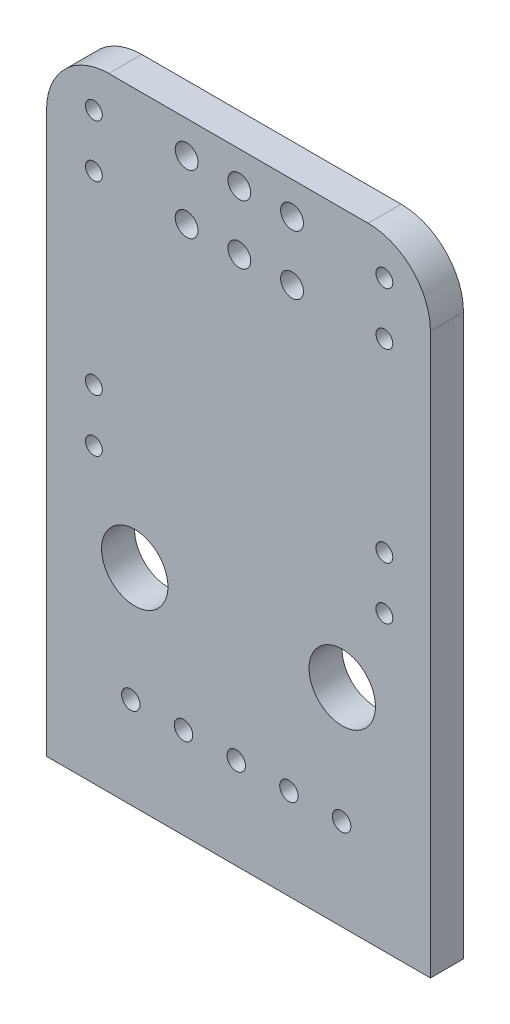
ISO-10303-21;
HEADER;
FILE_DESCRIPTION(('STEP AP214'),'2;1');
FILE_NAME('part.step','',(''),(''),'','','');
FILE_SCHEMA(('AUTOMOTIVE_DESIGN { 1 0 10303 214 1 1 1 1 }'));
ENDSEC;
DATA;
#1=APPLICATION_CONTEXT('core data for automotive mechanical design processes');
#2=APPLICATION_PROTOCOL_DEFINITION('international standard','automotive_design',2000,#1);
#3=PRODUCT_CONTEXT('',#1,'mechanical');
#4=PRODUCT('Part','Part','',(#3));
#5=PRODUCT_RELATED_PRODUCT_CATEGORY('part','',(#4));
#6=PRODUCT_DEFINITION_FORMATION('','',#4);
#7=PRODUCT_DEFINITION_CONTEXT('part definition',#1,'design');
#8=PRODUCT_DEFINITION('design','',#6,#7);
#9=PRODUCT_DEFINITION_SHAPE('','',#8);
#10=(LENGTH_UNIT() NAMED_UNIT(*) SI_UNIT(.MILLI.,.METRE.));
#11=(NAMED_UNIT(*) PLANE_ANGLE_UNIT() SI_UNIT($,.RADIAN.));
#12=(NAMED_UNIT(*) SI_UNIT($,.STERADIAN.) SOLID_ANGLE_UNIT());
#13=UNCERTAINTY_MEASURE_WITH_UNIT(LENGTH_MEASURE(1.E-05),#10,'distance_accuracy_value','');
#14=(GEOMETRIC_REPRESENTATION_CONTEXT(3) GLOBAL_UNCERTAINTY_ASSIGNED_CONTEXT((#13)) GLOBAL_UNIT_ASSIGNED_CONTEXT((#10,
#11,#12)) REPRESENTATION_CONTEXT('',''));
#15=CARTESIAN_POINT('',(0.,0.,0.));
#16=DIRECTION('',(0.,0.,1.));
#17=DIRECTION('',(1.,0.,0.));
#18=AXIS2_PLACEMENT_3D('',#15,#16,#17);
#19=CARTESIAN_POINT('',(156.54899597168,41.930000305176,1.59143954));
#20=DIRECTION('',(0.,0.,1.));
#21=DIRECTION('',(1.,0.,0.));
#22=AXIS2_PLACEMENT_3D('',#19,#20,#21);
#23=PLANE('',#22);
#24=CARTESIAN_POINT('',(172.82899902,70.04000216,1.59143954));
#25=DIRECTION('',(0.,0.,1.));
#26=DIRECTION('',(1.,0.,0.));
#27=AXIS2_PLACEMENT_3D('',#24,#25,#26);
#28=CIRCLE('',#27,0.4064);
#29=CARTESIAN_POINT('',(173.23539902,70.04000216,1.59143954));
#30=VERTEX_POINT('',#29);
#31=EDGE_CURVE('E26',#30,#30,#28,.T.);
#32=ORIENTED_EDGE('',*,*,#31,.F.);
#33=EDGE_LOOP('',(#32));
#34=FACE_BOUND('',#33,.T.);
#35=CARTESIAN_POINT('',(168.38000106,67.51999704,1.59143954));
#36=DIRECTION('',(0.,0.,1.));
#37=DIRECTION('',(1.,0.,0.));
#38=AXIS2_PLACEMENT_3D('',#35,#36,#37);
#39=CIRCLE('',#38,0.5499989);
#40=CARTESIAN_POINT('',(168.92999996,67.51999704,1.59143954));
#41=VERTEX_POINT('',#40);
#42=EDGE_CURVE('E355',#41,#41,#39,.T.);
#43=ORIENTED_EDGE('',*,*,#42,.F.);
#44=EDGE_LOOP('',(#43));
#45=FACE_BOUND('',#44,.T.);
#46=CARTESIAN_POINT('',(172.82899902,67.50000216,1.59143954));
#47=DIRECTION('',(0.,0.,1.));
#48=DIRECTION('',(1.,0.,0.));
#49=AXIS2_PLACEMENT_3D('',#46,#47,#48);
#50=CIRCLE('',#49,0.4064);
#51=CARTESIAN_POINT('',(173.23539902,67.50000216,1.59143954));
#52=VERTEX_POINT('',#51);
#53=EDGE_CURVE('E327',#52,#52,#50,.T.);
#54=ORIENTED_EDGE('',*,*,#53,.F.);
#55=EDGE_LOOP('',(#54));
#56=FACE_BOUND('',#55,.T.);
#57=CARTESIAN_POINT('',(168.38000106,70.36999642,1.59143954));
#58=DIRECTION('',(0.,0.,1.));
#59=DIRECTION('',(1.,0.,0.));
#60=AXIS2_PLACEMENT_3D('',#57,#58,#59);
#61=CIRCLE('',#60,0.5499989);
#62=CARTESIAN_POINT('',(168.92999996,70.36999642,1.59143954));
#63=VERTEX_POINT('',#62);
#64=EDGE_CURVE('E277',#63,#63,#61,.T.);
#65=ORIENTED_EDGE('',*,*,#64,.F.);
#66=EDGE_LOOP('',(#65));
#67=FACE_BOUND('',#66,.T.);
#68=CARTESIAN_POINT('',(165.84000106,70.36999642,1.59143954));
#69=DIRECTION('',(0.,0.,1.));
#70=DIRECTION('',(1.,0.,0.));
#71=AXIS2_PLACEMENT_3D('',#68,#69,#70);
#72=CIRCLE('',#71,0.5499989);
#73=CARTESIAN_POINT('',(166.38999996,70.36999642,1.59143954));
#74=VERTEX_POINT('',#73);
#75=EDGE_CURVE('E263',#74,#74,#72,.T.);
#76=ORIENTED_EDGE('',*,*,#75,.F.);
#77=EDGE_LOOP('',(#76));
#78=FACE_BOUND('',#77,.T.);
#79=CARTESIAN_POINT('',(165.84000106,67.51999704,1.59143954));
#80=DIRECTION('',(0.,0.,1.));
#81=DIRECTION('',(1.,0.,0.));
#82=AXIS2_PLACEMENT_3D('',#79,#80,#81);
#83=CIRCLE('',#82,0.5499989);
#84=CARTESIAN_POINT('',(166.38999996,67.51999704,1.59143954));
#85=VERTEX_POINT('',#84);
#86=EDGE_CURVE('E432',#85,#85,#83,.T.);
#87=ORIENTED_EDGE('',*,*,#86,.F.);
#88=EDGE_LOOP('',(#87));
#89=FACE_BOUND('',#88,.T.);
#90=CARTESIAN_POINT('',(172.82899902,56.04000222,1.59143954));
#91=DIRECTION('',(0.,0.,1.));
#92=DIRECTION('',(1.,0.,0.));
#93=AXIS2_PLACEMENT_3D('',#90,#91,#92);
#94=CIRCLE('',#93,0.4064);
#95=CARTESIAN_POINT('',(173.23539902,56.04000222,1.59143954));
#96=VERTEX_POINT('',#95);
#97=EDGE_CURVE('E282',#96,#96,#94,.T.);
#98=ORIENTED_EDGE('',*,*,#97,.F.);
#99=EDGE_LOOP('',(#98));
#100=FACE_BOUND('',#99,.T.);
#101=CARTESIAN_POINT('',(172.82899902,58.58000222,1.59143954));
#102=DIRECTION('',(0.,0.,1.));
#103=DIRECTION('',(1.,0.,0.));
#104=AXIS2_PLACEMENT_3D('',#101,#102,#103);
#105=CIRCLE('',#104,0.4064);
#106=CARTESIAN_POINT('',(173.23539902,58.58000222,1.59143954));
#107=VERTEX_POINT('',#106);
#108=EDGE_CURVE('E360',#107,#107,#105,.T.);
#109=ORIENTED_EDGE('',*,*,#108,.F.);
#110=EDGE_LOOP('',(#109));
#111=FACE_BOUND('',#110,.T.);
#112=CARTESIAN_POINT('',(170.79900054,51.93000028,1.59143954));
#113=DIRECTION('',(0.,0.,1.));
#114=DIRECTION('',(1.,0.,0.));
#115=AXIS2_PLACEMENT_3D('',#112,#113,#114);
#116=CIRCLE('',#115,1.59999934);
#117=CARTESIAN_POINT('',(172.39899988,51.93000028,1.59143954));
#118=VERTEX_POINT('',#117);
#119=EDGE_CURVE('E257',#118,#118,#116,.T.);
#120=ORIENTED_EDGE('',*,*,#119,.F.);
#121=EDGE_LOOP('',(#120));
#122=FACE_BOUND('',#121,.T.);
#123=CARTESIAN_POINT('',(168.22999882,46.32999878,1.59143954));
#124=DIRECTION('',(0.,0.,1.));
#125=DIRECTION('',(1.,0.,0.));
#126=AXIS2_PLACEMENT_3D('',#123,#124,#125);
#127=CIRCLE('',#126,0.4445);
#128=CARTESIAN_POINT('',(168.67449882,46.32999878,1.59143954));
#129=VERTEX_POINT('',#128);
#130=EDGE_CURVE('E396',#129,#129,#127,.T.);
#131=ORIENTED_EDGE('',*,*,#130,.F.);
#132=EDGE_LOOP('',(#131));
#133=FACE_BOUND('',#132,.T.);
#134=CARTESIAN_POINT('',(170.76999882,46.32999878,1.59143954));
#135=DIRECTION('',(0.,0.,1.));
#136=DIRECTION('',(1.,0.,0.));
#137=AXIS2_PLACEMENT_3D('',#134,#135,#136);
#138=CIRCLE('',#137,0.4445);
#139=CARTESIAN_POINT('',(171.21449882,46.32999878,1.59143954));
#140=VERTEX_POINT('',#139);
#141=EDGE_CURVE('E350',#140,#140,#138,.T.);
#142=ORIENTED_EDGE('',*,*,#141,.F.);
#143=EDGE_LOOP('',(#142));
#144=FACE_BOUND('',#143,.T.);
#145=CARTESIAN_POINT('',(163.30000106,70.36999642,1.59143954));
#146=DIRECTION('',(0.,0.,1.));
#147=DIRECTION('',(1.,0.,0.));
#148=AXIS2_PLACEMENT_3D('',#145,#146,#147);
#149=CIRCLE('',#148,0.5499989);
#150=CARTESIAN_POINT('',(163.84999996,70.36999642,1.59143954));
#151=VERTEX_POINT('',#150);
#152=EDGE_CURVE('E342',#151,#151,#149,.T.);
#153=ORIENTED_EDGE('',*,*,#152,.F.);
#154=EDGE_LOOP('',(#153));
#155=FACE_BOUND('',#154,.T.);
#156=CARTESIAN_POINT('',(158.82899908,70.04000216,1.59143954));
#157=DIRECTION('',(0.,0.,1.));
#158=DIRECTION('',(1.,0.,0.));
#159=AXIS2_PLACEMENT_3D('',#156,#157,#158);
#160=CIRCLE('',#159,0.4064);
#161=CARTESIAN_POINT('',(159.23539908,70.04000216,1.59143954));
#162=VERTEX_POINT('',#161);
#163=EDGE_CURVE('E314',#162,#162,#160,.T.);
#164=ORIENTED_EDGE('',*,*,#163,.F.);
#165=EDGE_LOOP('',(#164));
#166=FACE_BOUND('',#165,.T.);
#167=CARTESIAN_POINT('',(163.30000106,67.51999704,1.59143954));
#168=DIRECTION('',(0.,0.,1.));
#169=DIRECTION('',(1.,0.,0.));
#170=AXIS2_PLACEMENT_3D('',#167,#168,#169);
#171=CIRCLE('',#170,0.5499989);
#172=CARTESIAN_POINT('',(163.84999996,67.51999704,1.59143954));
#173=VERTEX_POINT('',#172);
#174=EDGE_CURVE('E297',#173,#173,#171,.T.);
#175=ORIENTED_EDGE('',*,*,#174,.F.);
#176=EDGE_LOOP('',(#175));
#177=FACE_BOUND('',#176,.T.);
#178=CARTESIAN_POINT('',(158.82899908,67.50000216,1.59143954));
#179=DIRECTION('',(0.,0.,1.));
#180=DIRECTION('',(1.,0.,0.));
#181=AXIS2_PLACEMENT_3D('',#178,#179,#180);
#182=CIRCLE('',#181,0.4064);
#183=CARTESIAN_POINT('',(159.23539908,67.50000216,1.59143954));
#184=VERTEX_POINT('',#183);
#185=EDGE_CURVE('E450',#184,#184,#182,.T.);
#186=ORIENTED_EDGE('',*,*,#185,.F.);
#187=EDGE_LOOP('',(#186));
#188=FACE_BOUND('',#187,.T.);
#189=CARTESIAN_POINT('',(158.82899908,58.58000222,1.59143954));
#190=DIRECTION('',(0.,0.,1.));
#191=DIRECTION('',(1.,0.,0.));
#192=AXIS2_PLACEMENT_3D('',#189,#190,#191);
#193=CIRCLE('',#192,0.4064);
#194=CARTESIAN_POINT('',(159.23539908,58.58000222,1.59143954));
#195=VERTEX_POINT('',#194);
#196=EDGE_CURVE('E302',#195,#195,#193,.T.);
#197=ORIENTED_EDGE('',*,*,#196,.F.);
#198=EDGE_LOOP('',(#197));
#199=FACE_BOUND('',#198,.T.);
#200=CARTESIAN_POINT('',(163.14999882,46.32999878,1.59143954));
#201=DIRECTION('',(0.,0.,1.));
#202=DIRECTION('',(1.,0.,0.));
#203=AXIS2_PLACEMENT_3D('',#200,#201,#202);
#204=CIRCLE('',#203,0.4445);
#205=CARTESIAN_POINT('',(163.59449882,46.32999878,1.59143954));
#206=VERTEX_POINT('',#205);
#207=EDGE_CURVE('E248',#206,#206,#204,.T.);
#208=ORIENTED_EDGE('',*,*,#207,.F.);
#209=EDGE_LOOP('',(#208));
#210=FACE_BOUND('',#209,.T.);
#211=CARTESIAN_POINT('',(160.79900022,51.93000028,1.59143954));
#212=DIRECTION('',(0.,0.,1.));
#213=DIRECTION('',(1.,0.,0.));
#214=AXIS2_PLACEMENT_3D('',#211,#212,#213);
#215=CIRCLE('',#214,1.59999934);
#216=CARTESIAN_POINT('',(162.39899956,51.93000028,1.59143954));
#217=VERTEX_POINT('',#216);
#218=EDGE_CURVE('E217',#217,#217,#215,.T.);
#219=ORIENTED_EDGE('',*,*,#218,.F.);
#220=EDGE_LOOP('',(#219));
#221=FACE_BOUND('',#220,.T.);
#222=CARTESIAN_POINT('',(165.68999882,46.32999878,1.59143954));
#223=DIRECTION('',(0.,0.,1.));
#224=DIRECTION('',(1.,0.,0.));
#225=AXIS2_PLACEMENT_3D('',#222,#223,#224);
#226=CIRCLE('',#225,0.4445);
#227=CARTESIAN_POINT('',(166.13449882,46.32999878,1.59143954));
#228=VERTEX_POINT('',#227);
#229=EDGE_CURVE('E346',#228,#228,#226,.T.);
#230=ORIENTED_EDGE('',*,*,#229,.F.);
#231=EDGE_LOOP('',(#230));
#232=FACE_BOUND('',#231,.T.);
#233=CARTESIAN_POINT('',(158.82899908,56.04000222,1.59143954));
#234=DIRECTION('',(0.,0.,1.));
#235=DIRECTION('',(1.,0.,0.));
#236=AXIS2_PLACEMENT_3D('',#233,#234,#235);
#237=CIRCLE('',#236,0.4064);
#238=CARTESIAN_POINT('',(159.23539908,56.04000222,1.59143954));
#239=VERTEX_POINT('',#238);
#240=EDGE_CURVE('E319',#239,#239,#237,.T.);
#241=ORIENTED_EDGE('',*,*,#240,.F.);
#242=EDGE_LOOP('',(#241));
#243=FACE_BOUND('',#242,.T.);
#244=CARTESIAN_POINT('',(160.60999882,46.32999878,1.59143954));
#245=DIRECTION('',(0.,0.,1.));
#246=DIRECTION('',(1.,0.,0.));
#247=AXIS2_PLACEMENT_3D('',#244,#245,#246);
#248=CIRCLE('',#247,0.4445);
#249=CARTESIAN_POINT('',(161.05449882,46.32999878,1.59143954));
#250=VERTEX_POINT('',#249);
#251=EDGE_CURVE('E465',#250,#250,#248,.T.);
#252=ORIENTED_EDGE('',*,*,#251,.F.);
#253=EDGE_LOOP('',(#252));
#254=FACE_BOUND('',#253,.T.);
#255=DIRECTION('',(-1.,0.,0.));
#256=VECTOR('',#255,1.);
#257=CARTESIAN_POINT('',(175.04899597168,41.930000305176,1.59143954));
#258=LINE('',#257,#256);
#259=CARTESIAN_POINT('',(175.04899597168,41.930000305176,1.59143954));
#260=VERTEX_POINT('',#259);
#261=CARTESIAN_POINT('',(156.54899597168,41.930000305176,1.59143954));
#262=VERTEX_POINT('',#261);
#263=EDGE_CURVE('E268',#260,#262,#258,.T.);
#264=ORIENTED_EDGE('',*,*,#263,.F.);
#265=DIRECTION('',(0.,-1.,0.));
#266=VECTOR('',#265,1.);
#267=CARTESIAN_POINT('',(175.04899597168,68.930000305176,1.59143954));
#268=LINE('',#267,#266);
#269=CARTESIAN_POINT('',(175.04899597168,68.930000305176,1.59143954));
#270=VERTEX_POINT('',#269);
#271=EDGE_CURVE('E238',#270,#260,#268,.T.);
#272=ORIENTED_EDGE('',*,*,#271,.F.);
#273=CARTESIAN_POINT('',(172.0479092773,68.928913610797,1.59143954));
#274=DIRECTION('',(0.,0.,-1.));
#275=DIRECTION('',(0.00036210027185109,0.999999934441694,0.));
#276=AXIS2_PLACEMENT_3D('',#273,#274,#275);
#277=CIRCLE('',#276,3.001086891125);
#278=CARTESIAN_POINT('',(172.04899597168,71.930000305176,1.59143954));
#279=VERTEX_POINT('',#278);
#280=EDGE_CURVE('E336',#279,#270,#277,.T.);
#281=ORIENTED_EDGE('',*,*,#280,.F.);
#282=DIRECTION('',(1.,0.,0.));
#283=VECTOR('',#282,1.);
#284=CARTESIAN_POINT('',(159.54899597168,71.930000305176,1.59143954));
#285=LINE('',#284,#283);
#286=CARTESIAN_POINT('',(159.54899597168,71.930000305176,1.59143954));
#287=VERTEX_POINT('',#286);
#288=EDGE_CURVE('E292',#287,#279,#285,.T.);
#289=ORIENTED_EDGE('',*,*,#288,.F.);
#290=CARTESIAN_POINT('',(159.55008266605,68.928913610797,1.59143954));
#291=DIRECTION('',(0.,0.,-1.));
#292=DIRECTION('',(-0.999999934441694,0.00036210027185109,0.));
#293=AXIS2_PLACEMENT_3D('',#290,#291,#292);
#294=CIRCLE('',#293,3.001086891125);
#295=CARTESIAN_POINT('',(156.54899597168,68.930000305176,1.59143954));
#296=VERTEX_POINT('',#295);
#297=EDGE_CURVE('E249',#296,#287,#294,.T.);
#298=ORIENTED_EDGE('',*,*,#297,.F.);
#299=DIRECTION('',(0.,1.,0.));
#300=VECTOR('',#299,1.);
#301=CARTESIAN_POINT('',(156.54899597168,41.930000305176,1.59143954));
#302=LINE('',#301,#300);
#303=EDGE_CURVE('E405',#262,#296,#302,.T.);
#304=ORIENTED_EDGE('',*,*,#303,.F.);
#305=EDGE_LOOP('',(#264,#272,#281,#289,#298,#304));
#306=FACE_BOUND('',#305,.T.);
#307=ADVANCED_FACE('F16',(#34,#45,#56,#67,#78,#89,#100,#111,#122,#133,#144,#155,#166,#177,#188,
#199,#210,#221,#232,#243,#254,#306),#23,.T.);
#308=CARTESIAN_POINT('',(156.54899597168,41.930000305176,0.));
#309=DIRECTION('',(0.,0.,1.));
#310=DIRECTION('',(1.,0.,0.));
#311=AXIS2_PLACEMENT_3D('',#308,#309,#310);
#312=PLANE('',#311);
#313=CARTESIAN_POINT('',(172.82899902,70.04000216,0.));
#314=DIRECTION('',(0.,0.,1.));
#315=DIRECTION('',(1.,0.,0.));
#316=AXIS2_PLACEMENT_3D('',#313,#314,#315);
#317=CIRCLE('',#316,0.4064);
#318=CARTESIAN_POINT('',(173.23539902,70.04000216,0.));
#319=VERTEX_POINT('',#318);
#320=EDGE_CURVE('E11',#319,#319,#317,.T.);
#321=ORIENTED_EDGE('',*,*,#320,.T.);
#322=EDGE_LOOP('',(#321));
#323=FACE_BOUND('',#322,.T.);
#324=CARTESIAN_POINT('',(168.38000106,67.51999704,0.));
#325=DIRECTION('',(0.,0.,1.));
#326=DIRECTION('',(1.,0.,0.));
#327=AXIS2_PLACEMENT_3D('',#324,#325,#326);
#328=CIRCLE('',#327,0.5499989);
#329=CARTESIAN_POINT('',(168.92999996,67.51999704,0.));
#330=VERTEX_POINT('',#329);
#331=EDGE_CURVE('E436',#330,#330,#328,.T.);
#332=ORIENTED_EDGE('',*,*,#331,.T.);
#333=EDGE_LOOP('',(#332));
#334=FACE_BOUND('',#333,.T.);
#335=CARTESIAN_POINT('',(172.82899902,67.50000216,0.));
#336=DIRECTION('',(0.,0.,1.));
#337=DIRECTION('',(1.,0.,0.));
#338=AXIS2_PLACEMENT_3D('',#335,#336,#337);
#339=CIRCLE('',#338,0.4064);
#340=CARTESIAN_POINT('',(173.23539902,67.50000216,0.));
#341=VERTEX_POINT('',#340);
#342=EDGE_CURVE('E356',#341,#341,#339,.T.);
#343=ORIENTED_EDGE('',*,*,#342,.T.);
#344=EDGE_LOOP('',(#343));
#345=FACE_BOUND('',#344,.T.);
#346=CARTESIAN_POINT('',(168.38000106,70.36999642,0.));
#347=DIRECTION('',(0.,0.,1.));
#348=DIRECTION('',(1.,0.,0.));
#349=AXIS2_PLACEMENT_3D('',#346,#347,#348);
#350=CIRCLE('',#349,0.5499989);
#351=CARTESIAN_POINT('',(168.92999996,70.36999642,0.));
#352=VERTEX_POINT('',#351);
#353=EDGE_CURVE('E273',#352,#352,#350,.T.);
#354=ORIENTED_EDGE('',*,*,#353,.T.);
#355=EDGE_LOOP('',(#354));
#356=FACE_BOUND('',#355,.T.);
#357=CARTESIAN_POINT('',(165.84000106,70.36999642,0.));
#358=DIRECTION('',(0.,0.,1.));
#359=DIRECTION('',(1.,0.,0.));
#360=AXIS2_PLACEMENT_3D('',#357,#358,#359);
#361=CIRCLE('',#360,0.5499989);
#362=CARTESIAN_POINT('',(166.38999996,70.36999642,0.));
#363=VERTEX_POINT('',#362);
#364=EDGE_CURVE('E266',#363,#363,#361,.T.);
#365=ORIENTED_EDGE('',*,*,#364,.T.);
#366=EDGE_LOOP('',(#365));
#367=FACE_BOUND('',#366,.T.);
#368=CARTESIAN_POINT('',(165.84000106,67.51999704,0.));
#369=DIRECTION('',(0.,0.,1.));
#370=DIRECTION('',(1.,0.,0.));
#371=AXIS2_PLACEMENT_3D('',#368,#369,#370);
#372=CIRCLE('',#371,0.5499989);
#373=CARTESIAN_POINT('',(166.38999996,67.51999704,0.));
#374=VERTEX_POINT('',#373);
#375=EDGE_CURVE('E287',#374,#374,#372,.T.);
#376=ORIENTED_EDGE('',*,*,#375,.T.);
#377=EDGE_LOOP('',(#376));
#378=FACE_BOUND('',#377,.T.);
#379=CARTESIAN_POINT('',(172.82899902,56.04000222,0.));
#380=DIRECTION('',(0.,0.,1.));
#381=DIRECTION('',(1.,0.,0.));
#382=AXIS2_PLACEMENT_3D('',#379,#380,#381);
#383=CIRCLE('',#382,0.4064);
#384=CARTESIAN_POINT('',(173.23539902,56.04000222,0.));
#385=VERTEX_POINT('',#384);
#386=EDGE_CURVE('E293',#385,#385,#383,.T.);
#387=ORIENTED_EDGE('',*,*,#386,.T.);
#388=EDGE_LOOP('',(#387));
#389=FACE_BOUND('',#388,.T.);
#390=CARTESIAN_POINT('',(172.82899902,58.58000222,0.));
#391=DIRECTION('',(0.,0.,1.));
#392=DIRECTION('',(1.,0.,0.));
#393=AXIS2_PLACEMENT_3D('',#390,#391,#392);
#394=CIRCLE('',#393,0.4064);
#395=CARTESIAN_POINT('',(173.23539902,58.58000222,0.));
#396=VERTEX_POINT('',#395);
#397=EDGE_CURVE('E283',#396,#396,#394,.T.);
#398=ORIENTED_EDGE('',*,*,#397,.T.);
#399=EDGE_LOOP('',(#398));
#400=FACE_BOUND('',#399,.T.);
#401=CARTESIAN_POINT('',(170.79900054,51.93000028,0.));
#402=DIRECTION('',(0.,0.,1.));
#403=DIRECTION('',(1.,0.,0.));
#404=AXIS2_PLACEMENT_3D('',#401,#402,#403);
#405=CIRCLE('',#404,1.59999934);
#406=CARTESIAN_POINT('',(172.39899988,51.93000028,0.));
#407=VERTEX_POINT('',#406);
#408=EDGE_CURVE('E261',#407,#407,#405,.T.);
#409=ORIENTED_EDGE('',*,*,#408,.T.);
#410=EDGE_LOOP('',(#409));
#411=FACE_BOUND('',#410,.T.);
#412=CARTESIAN_POINT('',(168.22999882,46.32999878,0.));
#413=DIRECTION('',(0.,0.,1.));
#414=DIRECTION('',(1.,0.,0.));
#415=AXIS2_PLACEMENT_3D('',#412,#413,#414);
#416=CIRCLE('',#415,0.4445);
#417=CARTESIAN_POINT('',(168.67449882,46.32999878,0.));
#418=VERTEX_POINT('',#417);
#419=EDGE_CURVE('E331',#418,#418,#416,.T.);
#420=ORIENTED_EDGE('',*,*,#419,.T.);
#421=EDGE_LOOP('',(#420));
#422=FACE_BOUND('',#421,.T.);
#423=CARTESIAN_POINT('',(170.76999882,46.32999878,0.));
#424=DIRECTION('',(0.,0.,1.));
#425=DIRECTION('',(1.,0.,0.));
#426=AXIS2_PLACEMENT_3D('',#423,#424,#425);
#427=CIRCLE('',#426,0.4445);
#428=CARTESIAN_POINT('',(171.21449882,46.32999878,0.));
#429=VERTEX_POINT('',#428);
#430=EDGE_CURVE('E367',#429,#429,#427,.T.);
#431=ORIENTED_EDGE('',*,*,#430,.T.);
#432=EDGE_LOOP('',(#431));
#433=FACE_BOUND('',#432,.T.);
#434=CARTESIAN_POINT('',(163.30000106,70.36999642,0.));
#435=DIRECTION('',(0.,0.,1.));
#436=DIRECTION('',(1.,0.,0.));
#437=AXIS2_PLACEMENT_3D('',#434,#435,#436);
#438=CIRCLE('',#437,0.5499989);
#439=CARTESIAN_POINT('',(163.84999996,70.36999642,0.));
#440=VERTEX_POINT('',#439);
#441=EDGE_CURVE('E338',#440,#440,#438,.T.);
#442=ORIENTED_EDGE('',*,*,#441,.T.);
#443=EDGE_LOOP('',(#442));
#444=FACE_BOUND('',#443,.T.);
#445=CARTESIAN_POINT('',(158.82899908,70.04000216,0.));
#446=DIRECTION('',(0.,0.,1.));
#447=DIRECTION('',(1.,0.,0.));
#448=AXIS2_PLACEMENT_3D('',#445,#446,#447);
#449=CIRCLE('',#448,0.4064);
#450=CARTESIAN_POINT('',(159.23539908,70.04000216,0.));
#451=VERTEX_POINT('',#450);
#452=EDGE_CURVE('E402',#451,#451,#449,.T.);
#453=ORIENTED_EDGE('',*,*,#452,.T.);
#454=EDGE_LOOP('',(#453));
#455=FACE_BOUND('',#454,.T.);
#456=CARTESIAN_POINT('',(163.30000106,67.51999704,0.));
#457=DIRECTION('',(0.,0.,1.));
#458=DIRECTION('',(1.,0.,0.));
#459=AXIS2_PLACEMENT_3D('',#456,#457,#458);
#460=CIRCLE('',#459,0.5499989);
#461=CARTESIAN_POINT('',(163.84999996,67.51999704,0.));
#462=VERTEX_POINT('',#461);
#463=EDGE_CURVE('E300',#462,#462,#460,.T.);
#464=ORIENTED_EDGE('',*,*,#463,.T.);
#465=EDGE_LOOP('',(#464));
#466=FACE_BOUND('',#465,.T.);
#467=CARTESIAN_POINT('',(158.82899908,67.50000216,0.));
#468=DIRECTION('',(0.,0.,1.));
#469=DIRECTION('',(1.,0.,0.));
#470=AXIS2_PLACEMENT_3D('',#467,#468,#469);
#471=CIRCLE('',#470,0.4064);
#472=CARTESIAN_POINT('',(159.23539908,67.50000216,0.));
#473=VERTEX_POINT('',#472);
#474=EDGE_CURVE('E309',#473,#473,#471,.T.);
#475=ORIENTED_EDGE('',*,*,#474,.T.);
#476=EDGE_LOOP('',(#475));
#477=FACE_BOUND('',#476,.T.);
#478=CARTESIAN_POINT('',(158.82899908,58.58000222,0.));
#479=DIRECTION('',(0.,0.,1.));
#480=DIRECTION('',(1.,0.,0.));
#481=AXIS2_PLACEMENT_3D('',#478,#479,#480);
#482=CIRCLE('',#481,0.4064);
#483=CARTESIAN_POINT('',(159.23539908,58.58000222,0.));
#484=VERTEX_POINT('',#483);
#485=EDGE_CURVE('E305',#484,#484,#482,.T.);
#486=ORIENTED_EDGE('',*,*,#485,.T.);
#487=EDGE_LOOP('',(#486));
#488=FACE_BOUND('',#487,.T.);
#489=CARTESIAN_POINT('',(163.14999882,46.32999878,0.));
#490=DIRECTION('',(0.,0.,1.));
#491=DIRECTION('',(1.,0.,0.));
#492=AXIS2_PLACEMENT_3D('',#489,#490,#491);
#493=CIRCLE('',#492,0.4445);
#494=CARTESIAN_POINT('',(163.59449882,46.32999878,0.));
#495=VERTEX_POINT('',#494);
#496=EDGE_CURVE('E244',#495,#495,#493,.T.);
#497=ORIENTED_EDGE('',*,*,#496,.T.);
#498=EDGE_LOOP('',(#497));
#499=FACE_BOUND('',#498,.T.);
#500=CARTESIAN_POINT('',(160.79900022,51.93000028,0.));
#501=DIRECTION('',(0.,0.,1.));
#502=DIRECTION('',(1.,0.,0.));
#503=AXIS2_PLACEMENT_3D('',#500,#501,#502);
#504=CIRCLE('',#503,1.59999934);
#505=CARTESIAN_POINT('',(162.39899956,51.93000028,0.));
#506=VERTEX_POINT('',#505);
#507=EDGE_CURVE('E223',#506,#506,#504,.T.);
#508=ORIENTED_EDGE('',*,*,#507,.T.);
#509=EDGE_LOOP('',(#508));
#510=FACE_BOUND('',#509,.T.);
#511=CARTESIAN_POINT('',(165.68999882,46.32999878,0.));
#512=DIRECTION('',(0.,0.,1.));
#513=DIRECTION('',(1.,0.,0.));
#514=AXIS2_PLACEMENT_3D('',#511,#512,#513);
#515=CIRCLE('',#514,0.4445);
#516=CARTESIAN_POINT('',(166.13449882,46.32999878,0.));
#517=VERTEX_POINT('',#516);
#518=EDGE_CURVE('E232',#517,#517,#515,.T.);
#519=ORIENTED_EDGE('',*,*,#518,.T.);
#520=EDGE_LOOP('',(#519));
#521=FACE_BOUND('',#520,.T.);
#522=CARTESIAN_POINT('',(158.82899908,56.04000222,0.));
#523=DIRECTION('',(0.,0.,1.));
#524=DIRECTION('',(1.,0.,0.));
#525=AXIS2_PLACEMENT_3D('',#522,#523,#524);
#526=CIRCLE('',#525,0.4064);
#527=CARTESIAN_POINT('',(159.23539908,56.04000222,0.));
#528=VERTEX_POINT('',#527);
#529=EDGE_CURVE('E315',#528,#528,#526,.T.);
#530=ORIENTED_EDGE('',*,*,#529,.T.);
#531=EDGE_LOOP('',(#530));
#532=FACE_BOUND('',#531,.T.);
#533=CARTESIAN_POINT('',(160.60999882,46.32999878,0.));
#534=DIRECTION('',(0.,0.,1.));
#535=DIRECTION('',(1.,0.,0.));
#536=AXIS2_PLACEMENT_3D('',#533,#534,#535);
#537=CIRCLE('',#536,0.4445);
#538=CARTESIAN_POINT('',(161.05449882,46.32999878,0.));
#539=VERTEX_POINT('',#538);
#540=EDGE_CURVE('E236',#539,#539,#537,.T.);
#541=ORIENTED_EDGE('',*,*,#540,.T.);
#542=EDGE_LOOP('',(#541));
#543=FACE_BOUND('',#542,.T.);
#544=DIRECTION('',(0.,1.,0.));
#545=VECTOR('',#544,1.);
#546=CARTESIAN_POINT('',(156.54899597168,41.930000305176,0.));
#547=LINE('',#546,#545);
#548=CARTESIAN_POINT('',(156.54899597168,41.930000305176,0.));
#549=VERTEX_POINT('',#548);
#550=CARTESIAN_POINT('',(156.54899597168,68.930000305176,0.));
#551=VERTEX_POINT('',#550);
#552=EDGE_CURVE('E254',#549,#551,#547,.T.);
#553=ORIENTED_EDGE('',*,*,#552,.T.);
#554=CARTESIAN_POINT('',(159.55008266605,68.928913610797,0.));
#555=DIRECTION('',(0.,0.,-1.));
#556=DIRECTION('',(-0.999999934441694,0.00036210027185109,0.));
#557=AXIS2_PLACEMENT_3D('',#554,#555,#556);
#558=CIRCLE('',#557,3.001086891125);
#559=CARTESIAN_POINT('',(159.54899597168,71.930000305176,0.));
#560=VERTEX_POINT('',#559);
#561=EDGE_CURVE('E288',#551,#560,#558,.T.);
#562=ORIENTED_EDGE('',*,*,#561,.T.);
#563=DIRECTION('',(1.,0.,0.));
#564=VECTOR('',#563,1.);
#565=CARTESIAN_POINT('',(159.54899597168,71.930000305176,0.));
#566=LINE('',#565,#564);
#567=CARTESIAN_POINT('',(172.04899597168,71.930000305176,0.));
#568=VERTEX_POINT('',#567);
#569=EDGE_CURVE('E332',#560,#568,#566,.T.);
#570=ORIENTED_EDGE('',*,*,#569,.T.);
#571=CARTESIAN_POINT('',(172.0479092773,68.928913610797,0.));
#572=DIRECTION('',(0.,0.,-1.));
#573=DIRECTION('',(0.00036210027185109,0.999999934441694,0.));
#574=AXIS2_PLACEMENT_3D('',#571,#572,#573);
#575=CIRCLE('',#574,3.001086891125);
#576=CARTESIAN_POINT('',(175.04899597168,68.930000305176,0.));
#577=VERTEX_POINT('',#576);
#578=EDGE_CURVE('E243',#568,#577,#575,.T.);
#579=ORIENTED_EDGE('',*,*,#578,.T.);
#580=DIRECTION('',(0.,-1.,0.));
#581=VECTOR('',#580,1.);
#582=CARTESIAN_POINT('',(175.04899597168,68.930000305176,0.));
#583=LINE('',#582,#581);
#584=CARTESIAN_POINT('',(175.04899597168,41.930000305176,0.));
#585=VERTEX_POINT('',#584);
#586=EDGE_CURVE('E272',#577,#585,#583,.T.);
#587=ORIENTED_EDGE('',*,*,#586,.T.);
#588=DIRECTION('',(-1.,0.,0.));
#589=VECTOR('',#588,1.);
#590=CARTESIAN_POINT('',(175.04899597168,41.930000305176,0.));
#591=LINE('',#590,#589);
#592=EDGE_CURVE('E271',#585,#549,#591,.T.);
#593=ORIENTED_EDGE('',*,*,#592,.T.);
#594=EDGE_LOOP('',(#553,#562,#570,#579,#587,#593));
#595=FACE_BOUND('',#594,.T.);
#596=ADVANCED_FACE('F511',(#323,#334,#345,#356,#367,#378,#389,#400,#411,#422,#433,#444,#455,
#466,#477,#488,#499,#510,#521,#532,#543,#595),#312,.F.);
#597=CARTESIAN_POINT('',(172.82899902,70.04000216,0.));
#598=DIRECTION('',(0.,0.,-1.));
#599=DIRECTION('',(1.,0.,0.));
#600=AXIS2_PLACEMENT_3D('',#597,#598,#599);
#601=CYLINDRICAL_SURFACE('',#600,0.4064);
#602=DIRECTION('',(0.,0.,1.));
#603=VECTOR('',#602,1.);
#604=CARTESIAN_POINT('',(173.23539902,70.04000216,0.));
#605=LINE('',#604,#603);
#606=EDGE_CURVE('E434',#319,#30,#605,.T.);
#607=ORIENTED_EDGE('',*,*,#606,.T.);
#608=ORIENTED_EDGE('',*,*,#31,.T.);
#609=ORIENTED_EDGE('',*,*,#606,.F.);
#610=ORIENTED_EDGE('',*,*,#320,.F.);
#611=EDGE_LOOP('',(#607,#608,#609,#610));
#612=FACE_BOUND('',#611,.T.);
#613=ADVANCED_FACE('F592',(#612),#601,.F.);
#614=CARTESIAN_POINT('',(168.38000106,67.51999704,0.));
#615=DIRECTION('',(0.,0.,-1.));
#616=DIRECTION('',(1.,0.,0.));
#617=AXIS2_PLACEMENT_3D('',#614,#615,#616);
#618=CYLINDRICAL_SURFACE('',#617,0.5499989);
#619=DIRECTION('',(0.,0.,1.));
#620=VECTOR('',#619,1.);
#621=CARTESIAN_POINT('',(168.92999996,67.51999704,0.));
#622=LINE('',#621,#620);
#623=EDGE_CURVE('E351',#330,#41,#622,.T.);
#624=ORIENTED_EDGE('',*,*,#623,.T.);
#625=ORIENTED_EDGE('',*,*,#42,.T.);
#626=ORIENTED_EDGE('',*,*,#623,.F.);
#627=ORIENTED_EDGE('',*,*,#331,.F.);
#628=EDGE_LOOP('',(#624,#625,#626,#627));
#629=FACE_BOUND('',#628,.T.);
#630=ADVANCED_FACE('F621',(#629),#618,.F.);
#631=CARTESIAN_POINT('',(172.82899902,67.50000216,0.));
#632=DIRECTION('',(0.,0.,-1.));
#633=DIRECTION('',(1.,0.,0.));
#634=AXIS2_PLACEMENT_3D('',#631,#632,#633);
#635=CYLINDRICAL_SURFACE('',#634,0.4064);
#636=DIRECTION('',(0.,0.,1.));
#637=VECTOR('',#636,1.);
#638=CARTESIAN_POINT('',(173.23539902,67.50000216,0.));
#639=LINE('',#638,#637);
#640=EDGE_CURVE('E276',#341,#52,#639,.T.);
#641=ORIENTED_EDGE('',*,*,#640,.T.);
#642=ORIENTED_EDGE('',*,*,#53,.T.);
#643=ORIENTED_EDGE('',*,*,#640,.F.);
#644=ORIENTED_EDGE('',*,*,#342,.F.);
#645=EDGE_LOOP('',(#641,#642,#643,#644));
#646=FACE_BOUND('',#645,.T.);
#647=ADVANCED_FACE('F617',(#646),#635,.F.);
#648=CARTESIAN_POINT('',(168.38000106,70.36999642,0.));
#649=DIRECTION('',(0.,0.,-1.));
#650=DIRECTION('',(1.,0.,0.));
#651=AXIS2_PLACEMENT_3D('',#648,#649,#650);
#652=CYLINDRICAL_SURFACE('',#651,0.5499989);
#653=DIRECTION('',(0.,0.,1.));
#654=VECTOR('',#653,1.);
#655=CARTESIAN_POINT('',(168.92999996,70.36999642,0.));
#656=LINE('',#655,#654);
#657=EDGE_CURVE('E323',#352,#63,#656,.T.);
#658=ORIENTED_EDGE('',*,*,#657,.T.);
#659=ORIENTED_EDGE('',*,*,#64,.T.);
#660=ORIENTED_EDGE('',*,*,#657,.F.);
#661=ORIENTED_EDGE('',*,*,#353,.F.);
#662=EDGE_LOOP('',(#658,#659,#660,#661));
#663=FACE_BOUND('',#662,.T.);
#664=ADVANCED_FACE('F620',(#663),#652,.F.);
#665=CARTESIAN_POINT('',(165.84000106,70.36999642,0.));
#666=DIRECTION('',(0.,0.,-1.));
#667=DIRECTION('',(1.,0.,0.));
#668=AXIS2_PLACEMENT_3D('',#665,#666,#667);
#669=CYLINDRICAL_SURFACE('',#668,0.5499989);
#670=DIRECTION('',(0.,0.,1.));
#671=VECTOR('',#670,1.);
#672=CARTESIAN_POINT('',(166.38999996,70.36999642,0.));
#673=LINE('',#672,#671);
#674=EDGE_CURVE('E267',#363,#74,#673,.T.);
#675=ORIENTED_EDGE('',*,*,#674,.T.);
#676=ORIENTED_EDGE('',*,*,#75,.T.);
#677=ORIENTED_EDGE('',*,*,#674,.F.);
#678=ORIENTED_EDGE('',*,*,#364,.F.);
#679=EDGE_LOOP('',(#675,#676,#677,#678));
#680=FACE_BOUND('',#679,.T.);
#681=ADVANCED_FACE('F637',(#680),#669,.F.);
#682=CARTESIAN_POINT('',(165.84000106,67.51999704,0.));
#683=DIRECTION('',(0.,0.,-1.));
#684=DIRECTION('',(1.,0.,0.));
#685=AXIS2_PLACEMENT_3D('',#682,#683,#684);
#686=CYLINDRICAL_SURFACE('',#685,0.5499989);
#687=DIRECTION('',(0.,0.,1.));
#688=VECTOR('',#687,1.);
#689=CARTESIAN_POINT('',(166.38999996,67.51999704,0.));
#690=LINE('',#689,#688);
#691=EDGE_CURVE('E295',#374,#85,#690,.T.);
#692=ORIENTED_EDGE('',*,*,#691,.T.);
#693=ORIENTED_EDGE('',*,*,#86,.T.);
#694=ORIENTED_EDGE('',*,*,#691,.F.);
#695=ORIENTED_EDGE('',*,*,#375,.F.);
#696=EDGE_LOOP('',(#692,#693,#694,#695));
#697=FACE_BOUND('',#696,.T.);
#698=ADVANCED_FACE('F635',(#697),#686,.F.);
#699=CARTESIAN_POINT('',(172.82899902,56.04000222,0.));
#700=DIRECTION('',(0.,0.,-1.));
#701=DIRECTION('',(1.,0.,0.));
#702=AXIS2_PLACEMENT_3D('',#699,#700,#701);
#703=CYLINDRICAL_SURFACE('',#702,0.4064);
#704=DIRECTION('',(0.,0.,1.));
#705=VECTOR('',#704,1.);
#706=CARTESIAN_POINT('',(173.23539902,56.04000222,0.));
#707=LINE('',#706,#705);
#708=EDGE_CURVE('E278',#385,#96,#707,.T.);
#709=ORIENTED_EDGE('',*,*,#708,.T.);
#710=ORIENTED_EDGE('',*,*,#97,.T.);
#711=ORIENTED_EDGE('',*,*,#708,.F.);
#712=ORIENTED_EDGE('',*,*,#386,.F.);
#713=EDGE_LOOP('',(#709,#710,#711,#712));
#714=FACE_BOUND('',#713,.T.);
#715=ADVANCED_FACE('F631',(#714),#703,.F.);
#716=CARTESIAN_POINT('',(172.82899902,58.58000222,0.));
#717=DIRECTION('',(0.,0.,-1.));
#718=DIRECTION('',(1.,0.,0.));
#719=AXIS2_PLACEMENT_3D('',#716,#717,#718);
#720=CYLINDRICAL_SURFACE('',#719,0.4064);
#721=DIRECTION('',(0.,0.,1.));
#722=VECTOR('',#721,1.);
#723=CARTESIAN_POINT('',(173.23539902,58.58000222,0.));
#724=LINE('',#723,#722);
#725=EDGE_CURVE('E363',#396,#107,#724,.T.);
#726=ORIENTED_EDGE('',*,*,#725,.T.);
#727=ORIENTED_EDGE('',*,*,#108,.T.);
#728=ORIENTED_EDGE('',*,*,#725,.F.);
#729=ORIENTED_EDGE('',*,*,#397,.F.);
#730=EDGE_LOOP('',(#726,#727,#728,#729));
#731=FACE_BOUND('',#730,.T.);
#732=ADVANCED_FACE('F634',(#731),#720,.F.);
#733=CARTESIAN_POINT('',(170.79900054,51.93000028,0.));
#734=DIRECTION('',(0.,0.,-1.));
#735=DIRECTION('',(1.,0.,0.));
#736=AXIS2_PLACEMENT_3D('',#733,#734,#735);
#737=CYLINDRICAL_SURFACE('',#736,1.59999934);
#738=DIRECTION('',(0.,0.,1.));
#739=VECTOR('',#738,1.);
#740=CARTESIAN_POINT('',(172.39899988,51.93000028,0.));
#741=LINE('',#740,#739);
#742=EDGE_CURVE('E262',#407,#118,#741,.T.);
#743=ORIENTED_EDGE('',*,*,#742,.T.);
#744=ORIENTED_EDGE('',*,*,#119,.T.);
#745=ORIENTED_EDGE('',*,*,#742,.F.);
#746=ORIENTED_EDGE('',*,*,#408,.F.);
#747=EDGE_LOOP('',(#743,#744,#745,#746));
#748=FACE_BOUND('',#747,.T.);
#749=ADVANCED_FACE('F643',(#748),#737,.F.);
#750=CARTESIAN_POINT('',(168.22999882,46.32999878,0.));
#751=DIRECTION('',(0.,0.,-1.));
#752=DIRECTION('',(1.,0.,0.));
#753=AXIS2_PLACEMENT_3D('',#750,#751,#752);
#754=CYLINDRICAL_SURFACE('',#753,0.4445);
#755=DIRECTION('',(0.,0.,1.));
#756=VECTOR('',#755,1.);
#757=CARTESIAN_POINT('',(168.67449882,46.32999878,0.));
#758=LINE('',#757,#756);
#759=EDGE_CURVE('E428',#418,#129,#758,.T.);
#760=ORIENTED_EDGE('',*,*,#759,.T.);
#761=ORIENTED_EDGE('',*,*,#130,.T.);
#762=ORIENTED_EDGE('',*,*,#759,.F.);
#763=ORIENTED_EDGE('',*,*,#419,.F.);
#764=EDGE_LOOP('',(#760,#761,#762,#763));
#765=FACE_BOUND('',#764,.T.);
#766=ADVANCED_FACE('F651',(#765),#754,.F.);
#767=CARTESIAN_POINT('',(170.76999882,46.32999878,0.));
#768=DIRECTION('',(0.,0.,-1.));
#769=DIRECTION('',(1.,0.,0.));
#770=AXIS2_PLACEMENT_3D('',#767,#768,#769);
#771=CYLINDRICAL_SURFACE('',#770,0.4445);
#772=DIRECTION('',(0.,0.,1.));
#773=VECTOR('',#772,1.);
#774=CARTESIAN_POINT('',(171.21449882,46.32999878,0.));
#775=LINE('',#774,#773);
#776=EDGE_CURVE('E341',#429,#140,#775,.T.);
#777=ORIENTED_EDGE('',*,*,#776,.T.);
#778=ORIENTED_EDGE('',*,*,#141,.T.);
#779=ORIENTED_EDGE('',*,*,#776,.F.);
#780=ORIENTED_EDGE('',*,*,#430,.F.);
#781=EDGE_LOOP('',(#777,#778,#779,#780));
#782=FACE_BOUND('',#781,.T.);
#783=ADVANCED_FACE('F655',(#782),#771,.F.);
#784=CARTESIAN_POINT('',(163.30000106,70.36999642,0.));
#785=DIRECTION('',(0.,0.,-1.));
#786=DIRECTION('',(1.,0.,0.));
#787=AXIS2_PLACEMENT_3D('',#784,#785,#786);
#788=CYLINDRICAL_SURFACE('',#787,0.5499989);
#789=DIRECTION('',(0.,0.,1.));
#790=VECTOR('',#789,1.);
#791=CARTESIAN_POINT('',(163.84999996,70.36999642,0.));
#792=LINE('',#791,#790);
#793=EDGE_CURVE('E20',#440,#151,#792,.T.);
#794=ORIENTED_EDGE('',*,*,#793,.T.);
#795=ORIENTED_EDGE('',*,*,#152,.T.);
#796=ORIENTED_EDGE('',*,*,#793,.F.);
#797=ORIENTED_EDGE('',*,*,#441,.F.);
#798=EDGE_LOOP('',(#794,#795,#796,#797));
#799=FACE_BOUND('',#798,.T.);
#800=ADVANCED_FACE('F571',(#799),#788,.F.);
#801=CARTESIAN_POINT('',(158.82899908,70.04000216,0.));
#802=DIRECTION('',(0.,0.,-1.));
#803=DIRECTION('',(1.,0.,0.));
#804=AXIS2_PLACEMENT_3D('',#801,#802,#803);
#805=CYLINDRICAL_SURFACE('',#804,0.4064);
#806=DIRECTION('',(0.,0.,1.));
#807=VECTOR('',#806,1.);
#808=CARTESIAN_POINT('',(159.23539908,70.04000216,0.));
#809=LINE('',#808,#807);
#810=EDGE_CURVE('E310',#451,#162,#809,.T.);
#811=ORIENTED_EDGE('',*,*,#810,.T.);
#812=ORIENTED_EDGE('',*,*,#163,.T.);
#813=ORIENTED_EDGE('',*,*,#810,.F.);
#814=ORIENTED_EDGE('',*,*,#452,.F.);
#815=EDGE_LOOP('',(#811,#812,#813,#814));
#816=FACE_BOUND('',#815,.T.);
#817=ADVANCED_FACE('F644',(#816),#805,.F.);
#818=CARTESIAN_POINT('',(163.30000106,67.51999704,0.));
#819=DIRECTION('',(0.,0.,-1.));
#820=DIRECTION('',(1.,0.,0.));
#821=AXIS2_PLACEMENT_3D('',#818,#819,#820);
#822=CYLINDRICAL_SURFACE('',#821,0.5499989);
#823=DIRECTION('',(0.,0.,1.));
#824=VECTOR('',#823,1.);
#825=CARTESIAN_POINT('',(163.84999996,67.51999704,0.));
#826=LINE('',#825,#824);
#827=EDGE_CURVE('E301',#462,#173,#826,.T.);
#828=ORIENTED_EDGE('',*,*,#827,.T.);
#829=ORIENTED_EDGE('',*,*,#174,.T.);
#830=ORIENTED_EDGE('',*,*,#827,.F.);
#831=ORIENTED_EDGE('',*,*,#463,.F.);
#832=EDGE_LOOP('',(#828,#829,#830,#831));
#833=FACE_BOUND('',#832,.T.);
#834=ADVANCED_FACE('F646',(#833),#822,.F.);
#835=CARTESIAN_POINT('',(158.82899908,67.50000216,0.));
#836=DIRECTION('',(0.,0.,-1.));
#837=DIRECTION('',(1.,0.,0.));
#838=AXIS2_PLACEMENT_3D('',#835,#836,#837);
#839=CYLINDRICAL_SURFACE('',#838,0.4064);
#840=DIRECTION('',(0.,0.,1.));
#841=VECTOR('',#840,1.);
#842=CARTESIAN_POINT('',(159.23539908,67.50000216,0.));
#843=LINE('',#842,#841);
#844=EDGE_CURVE('E453',#473,#184,#843,.T.);
#845=ORIENTED_EDGE('',*,*,#844,.T.);
#846=ORIENTED_EDGE('',*,*,#185,.T.);
#847=ORIENTED_EDGE('',*,*,#844,.F.);
#848=ORIENTED_EDGE('',*,*,#474,.F.);
#849=EDGE_LOOP('',(#845,#846,#847,#848));
#850=FACE_BOUND('',#849,.T.);
#851=ADVANCED_FACE('F626',(#850),#839,.F.);
#852=CARTESIAN_POINT('',(158.82899908,58.58000222,0.));
#853=DIRECTION('',(0.,0.,-1.));
#854=DIRECTION('',(1.,0.,0.));
#855=AXIS2_PLACEMENT_3D('',#852,#853,#854);
#856=CYLINDRICAL_SURFACE('',#855,0.4064);
#857=DIRECTION('',(0.,0.,1.));
#858=VECTOR('',#857,1.);
#859=CARTESIAN_POINT('',(159.23539908,58.58000222,0.));
#860=LINE('',#859,#858);
#861=EDGE_CURVE('E247',#484,#195,#860,.T.);
#862=ORIENTED_EDGE('',*,*,#861,.T.);
#863=ORIENTED_EDGE('',*,*,#196,.T.);
#864=ORIENTED_EDGE('',*,*,#861,.F.);
#865=ORIENTED_EDGE('',*,*,#485,.F.);
#866=EDGE_LOOP('',(#862,#863,#864,#865));
#867=FACE_BOUND('',#866,.T.);
#868=ADVANCED_FACE('F623',(#867),#856,.F.);
#869=CARTESIAN_POINT('',(163.14999882,46.32999878,0.));
#870=DIRECTION('',(0.,0.,-1.));
#871=DIRECTION('',(1.,0.,0.));
#872=AXIS2_PLACEMENT_3D('',#869,#870,#871);
#873=CYLINDRICAL_SURFACE('',#872,0.4445);
#874=DIRECTION('',(0.,0.,1.));
#875=VECTOR('',#874,1.);
#876=CARTESIAN_POINT('',(163.59449882,46.32999878,0.));
#877=LINE('',#876,#875);
#878=EDGE_CURVE('E230',#495,#206,#877,.T.);
#879=ORIENTED_EDGE('',*,*,#878,.T.);
#880=ORIENTED_EDGE('',*,*,#207,.T.);
#881=ORIENTED_EDGE('',*,*,#878,.F.);
#882=ORIENTED_EDGE('',*,*,#496,.F.);
#883=EDGE_LOOP('',(#879,#880,#881,#882));
#884=FACE_BOUND('',#883,.T.);
#885=ADVANCED_FACE('F588',(#884),#873,.F.);
#886=CARTESIAN_POINT('',(160.79900022,51.93000028,0.));
#887=DIRECTION('',(0.,0.,-1.));
#888=DIRECTION('',(1.,0.,0.));
#889=AXIS2_PLACEMENT_3D('',#886,#887,#888);
#890=CYLINDRICAL_SURFACE('',#889,1.59999934);
#891=DIRECTION('',(0.,0.,1.));
#892=VECTOR('',#891,1.);
#893=CARTESIAN_POINT('',(162.39899956,51.93000028,0.));
#894=LINE('',#893,#892);
#895=EDGE_CURVE('E220',#506,#217,#894,.T.);
#896=ORIENTED_EDGE('',*,*,#895,.T.);
#897=ORIENTED_EDGE('',*,*,#218,.T.);
#898=ORIENTED_EDGE('',*,*,#895,.F.);
#899=ORIENTED_EDGE('',*,*,#507,.F.);
#900=EDGE_LOOP('',(#896,#897,#898,#899));
#901=FACE_BOUND('',#900,.T.);
#902=ADVANCED_FACE('F218',(#901),#890,.F.);
#903=CARTESIAN_POINT('',(165.68999882,46.32999878,0.));
#904=DIRECTION('',(0.,0.,-1.));
#905=DIRECTION('',(1.,0.,0.));
#906=AXIS2_PLACEMENT_3D('',#903,#904,#905);
#907=CYLINDRICAL_SURFACE('',#906,0.4445);
#908=DIRECTION('',(0.,0.,1.));
#909=VECTOR('',#908,1.);
#910=CARTESIAN_POINT('',(166.13449882,46.32999878,0.));
#911=LINE('',#910,#909);
#912=EDGE_CURVE('E318',#517,#228,#911,.T.);
#913=ORIENTED_EDGE('',*,*,#912,.T.);
#914=ORIENTED_EDGE('',*,*,#229,.T.);
#915=ORIENTED_EDGE('',*,*,#912,.F.);
#916=ORIENTED_EDGE('',*,*,#518,.F.);
#917=EDGE_LOOP('',(#913,#914,#915,#916));
#918=FACE_BOUND('',#917,.T.);
#919=ADVANCED_FACE('F506',(#918),#907,.F.);
#920=CARTESIAN_POINT('',(158.82899908,56.04000222,0.));
#921=DIRECTION('',(0.,0.,-1.));
#922=DIRECTION('',(1.,0.,0.));
#923=AXIS2_PLACEMENT_3D('',#920,#921,#922);
#924=CYLINDRICAL_SURFACE('',#923,0.4064);
#925=DIRECTION('',(0.,0.,1.));
#926=VECTOR('',#925,1.);
#927=CARTESIAN_POINT('',(159.23539908,56.04000222,0.));
#928=LINE('',#927,#926);
#929=EDGE_CURVE('E390',#528,#239,#928,.T.);
#930=ORIENTED_EDGE('',*,*,#929,.T.);
#931=ORIENTED_EDGE('',*,*,#240,.T.);
#932=ORIENTED_EDGE('',*,*,#929,.F.);
#933=ORIENTED_EDGE('',*,*,#529,.F.);
#934=EDGE_LOOP('',(#930,#931,#932,#933));
#935=FACE_BOUND('',#934,.T.);
#936=ADVANCED_FACE('F630',(#935),#924,.F.);
#937=CARTESIAN_POINT('',(160.60999882,46.32999878,0.));
#938=DIRECTION('',(0.,0.,-1.));
#939=DIRECTION('',(1.,0.,0.));
#940=AXIS2_PLACEMENT_3D('',#937,#938,#939);
#941=CYLINDRICAL_SURFACE('',#940,0.4445);
#942=DIRECTION('',(0.,0.,1.));
#943=VECTOR('',#942,1.);
#944=CARTESIAN_POINT('',(161.05449882,46.32999878,0.));
#945=LINE('',#944,#943);
#946=EDGE_CURVE('E469',#539,#250,#945,.T.);
#947=ORIENTED_EDGE('',*,*,#946,.T.);
#948=ORIENTED_EDGE('',*,*,#251,.T.);
#949=ORIENTED_EDGE('',*,*,#946,.F.);
#950=ORIENTED_EDGE('',*,*,#540,.F.);
#951=EDGE_LOOP('',(#947,#948,#949,#950));
#952=FACE_BOUND('',#951,.T.);
#953=ADVANCED_FACE('F663',(#952),#941,.F.);
#954=CARTESIAN_POINT('',(175.04899597168,41.930000305176,0.));
#955=DIRECTION('',(0.,-1.,0.));
#956=DIRECTION('',(0.,0.,-1.));
#957=AXIS2_PLACEMENT_3D('',#954,#955,#956);
#958=PLANE('',#957);
#959=DIRECTION('',(0.,0.,1.));
#960=VECTOR('',#959,1.);
#961=CARTESIAN_POINT('',(175.04899597168,41.930000305176,0.));
#962=LINE('',#961,#960);
#963=EDGE_CURVE('E242',#585,#260,#962,.T.);
#964=ORIENTED_EDGE('',*,*,#963,.T.);
#965=ORIENTED_EDGE('',*,*,#263,.T.);
#966=DIRECTION('',(0.,0.,1.));
#967=VECTOR('',#966,1.);
#968=CARTESIAN_POINT('',(156.54899597168,41.930000305176,0.));
#969=LINE('',#968,#967);
#970=EDGE_CURVE('E410',#549,#262,#969,.T.);
#971=ORIENTED_EDGE('',*,*,#970,.F.);
#972=ORIENTED_EDGE('',*,*,#592,.F.);
#973=EDGE_LOOP('',(#964,#965,#971,#972));
#974=FACE_BOUND('',#973,.T.);
#975=ADVANCED_FACE('F18',(#974),#958,.T.);
#976=CARTESIAN_POINT('',(175.04899597168,68.930000305176,0.));
#977=DIRECTION('',(1.,0.,0.));
#978=DIRECTION('',(0.,1.,0.));
#979=AXIS2_PLACEMENT_3D('',#976,#977,#978);
#980=PLANE('',#979);
#981=DIRECTION('',(0.,0.,1.));
#982=VECTOR('',#981,1.);
#983=CARTESIAN_POINT('',(175.04899597168,68.930000305176,0.));
#984=LINE('',#983,#982);
#985=EDGE_CURVE('E386',#577,#270,#984,.T.);
#986=ORIENTED_EDGE('',*,*,#985,.T.);
#987=ORIENTED_EDGE('',*,*,#271,.T.);
#988=ORIENTED_EDGE('',*,*,#963,.F.);
#989=ORIENTED_EDGE('',*,*,#586,.F.);
#990=EDGE_LOOP('',(#986,#987,#988,#989));
#991=FACE_BOUND('',#990,.T.);
#992=ADVANCED_FACE('F527',(#991),#980,.T.);
#993=CARTESIAN_POINT('',(172.0479092773,68.928913610797,0.));
#994=DIRECTION('',(0.,0.,-1.));
#995=DIRECTION('',(0.00036210027185109,0.999999934441694,0.));
#996=AXIS2_PLACEMENT_3D('',#993,#994,#995);
#997=CYLINDRICAL_SURFACE('',#996,3.001086891125);
#998=DIRECTION('',(0.,0.,1.));
#999=VECTOR('',#998,1.);
#1000=CARTESIAN_POINT('',(172.04899597168,71.930000305176,0.));
#1001=LINE('',#1000,#999);
#1002=EDGE_CURVE('E337',#568,#279,#1001,.T.);
#1003=ORIENTED_EDGE('',*,*,#1002,.T.);
#1004=ORIENTED_EDGE('',*,*,#280,.T.);
#1005=ORIENTED_EDGE('',*,*,#985,.F.);
#1006=ORIENTED_EDGE('',*,*,#578,.F.);
#1007=EDGE_LOOP('',(#1003,#1004,#1005,#1006));
#1008=FACE_BOUND('',#1007,.T.);
#1009=ADVANCED_FACE('F531',(#1008),#997,.T.);
#1010=CARTESIAN_POINT('',(159.54899597168,71.930000305176,0.));
#1011=DIRECTION('',(0.,1.,0.));
#1012=DIRECTION('',(1.,0.,0.));
#1013=AXIS2_PLACEMENT_3D('',#1010,#1011,#1012);
#1014=PLANE('',#1013);
#1015=DIRECTION('',(0.,0.,1.));
#1016=VECTOR('',#1015,1.);
#1017=CARTESIAN_POINT('',(159.54899597168,71.930000305176,0.));
#1018=LINE('',#1017,#1016);
#1019=EDGE_CURVE('E253',#560,#287,#1018,.T.);
#1020=ORIENTED_EDGE('',*,*,#1019,.T.);
#1021=ORIENTED_EDGE('',*,*,#288,.T.);
#1022=ORIENTED_EDGE('',*,*,#1002,.F.);
#1023=ORIENTED_EDGE('',*,*,#569,.F.);
#1024=EDGE_LOOP('',(#1020,#1021,#1022,#1023));
#1025=FACE_BOUND('',#1024,.T.);
#1026=ADVANCED_FACE('F606',(#1025),#1014,.T.);
#1027=CARTESIAN_POINT('',(159.55008266605,68.928913610797,0.));
#1028=DIRECTION('',(0.,0.,-1.));
#1029=DIRECTION('',(-0.999999934441694,0.00036210027185109,0.));
#1030=AXIS2_PLACEMENT_3D('',#1027,#1028,#1029);
#1031=CYLINDRICAL_SURFACE('',#1030,3.001086891125);
#1032=DIRECTION('',(0.,0.,1.));
#1033=VECTOR('',#1032,1.);
#1034=CARTESIAN_POINT('',(156.54899597168,68.930000305176,0.));
#1035=LINE('',#1034,#1033);
#1036=EDGE_CURVE('E409',#551,#296,#1035,.T.);
#1037=ORIENTED_EDGE('',*,*,#1036,.T.);
#1038=ORIENTED_EDGE('',*,*,#297,.T.);
#1039=ORIENTED_EDGE('',*,*,#1019,.F.);
#1040=ORIENTED_EDGE('',*,*,#561,.F.);
#1041=EDGE_LOOP('',(#1037,#1038,#1039,#1040));
#1042=FACE_BOUND('',#1041,.T.);
#1043=ADVANCED_FACE('F604',(#1042),#1031,.T.);
#1044=CARTESIAN_POINT('',(156.54899597168,41.930000305176,0.));
#1045=DIRECTION('',(-1.,0.,0.));
#1046=DIRECTION('',(0.,0.,1.));
#1047=AXIS2_PLACEMENT_3D('',#1044,#1045,#1046);
#1048=PLANE('',#1047);
#1049=ORIENTED_EDGE('',*,*,#970,.T.);
#1050=ORIENTED_EDGE('',*,*,#303,.T.);
#1051=ORIENTED_EDGE('',*,*,#1036,.F.);
#1052=ORIENTED_EDGE('',*,*,#552,.F.);
#1053=EDGE_LOOP('',(#1049,#1050,#1051,#1052));
#1054=FACE_BOUND('',#1053,.T.);
#1055=ADVANCED_FACE('F602',(#1054),#1048,.T.);
#1056=CLOSED_SHELL('',(#307,#596,#613,#630,#647,#664,#681,#698,#715,#732,#749,#766,#783,#800,
#817,#834,#851,#868,#885,#902,#919,#936,#953,#975,#992,#1009,#1026,#1043,#1055));
#1057=MANIFOLD_SOLID_BREP('B1',#1056);
#1058=ADVANCED_BREP_SHAPE_REPRESENTATION('',(#18,#1057),#14);
#1059=SHAPE_DEFINITION_REPRESENTATION(#9,#1058);
ENDSEC;
END-ISO-10303-21;
